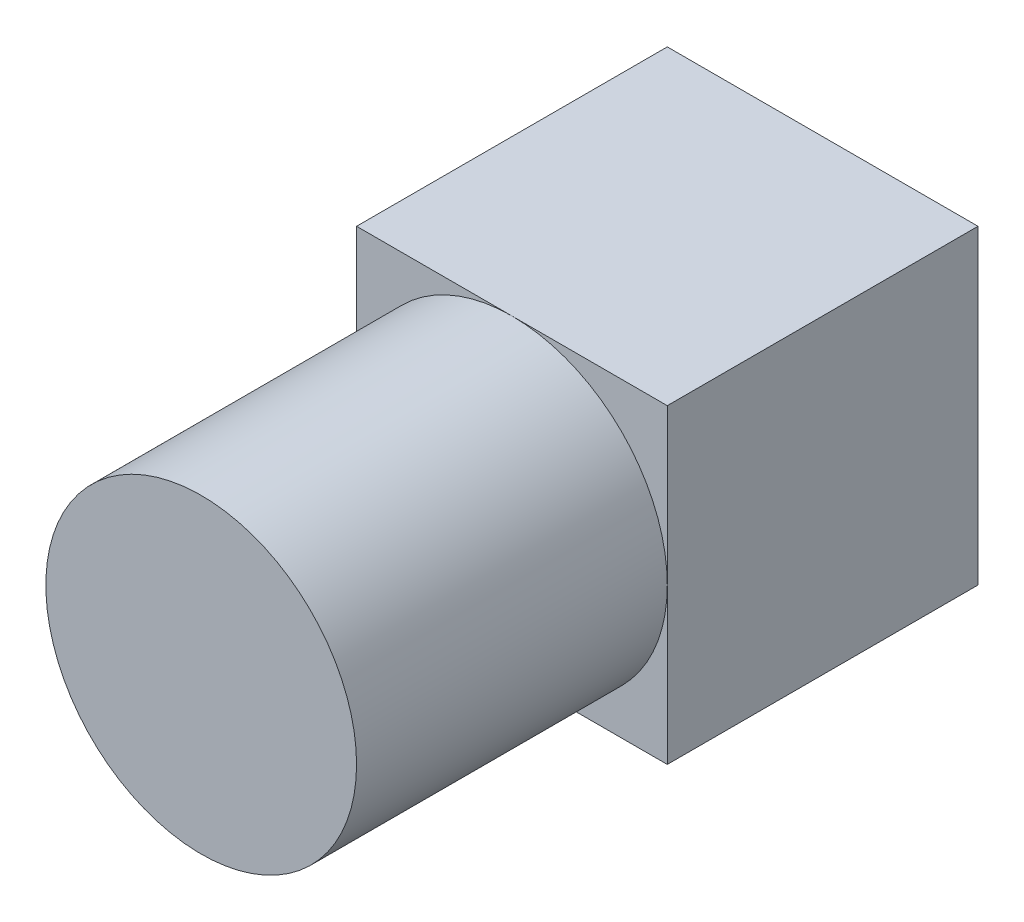
ISO-10303-21;
HEADER;
FILE_DESCRIPTION(('STEP AP214'),'2;1');
FILE_NAME('part.step','',(''),(''),'','','');
FILE_SCHEMA(('AUTOMOTIVE_DESIGN { 1 0 10303 214 1 1 1 1 }'));
ENDSEC;
DATA;
#1=APPLICATION_CONTEXT('core data for automotive mechanical design processes');
#2=APPLICATION_PROTOCOL_DEFINITION('international standard','automotive_design',2000,#1);
#3=PRODUCT_CONTEXT('',#1,'mechanical');
#4=PRODUCT('Part','Part','',(#3));
#5=PRODUCT_RELATED_PRODUCT_CATEGORY('part','',(#4));
#6=PRODUCT_DEFINITION_FORMATION('','',#4);
#7=PRODUCT_DEFINITION_CONTEXT('part definition',#1,'design');
#8=PRODUCT_DEFINITION('design','',#6,#7);
#9=PRODUCT_DEFINITION_SHAPE('','',#8);
#10=(LENGTH_UNIT() NAMED_UNIT(*) SI_UNIT(.MILLI.,.METRE.));
#11=(NAMED_UNIT(*) PLANE_ANGLE_UNIT() SI_UNIT($,.RADIAN.));
#12=(NAMED_UNIT(*) SI_UNIT($,.STERADIAN.) SOLID_ANGLE_UNIT());
#13=UNCERTAINTY_MEASURE_WITH_UNIT(LENGTH_MEASURE(1.E-05),#10,'distance_accuracy_value','');
#14=(GEOMETRIC_REPRESENTATION_CONTEXT(3) GLOBAL_UNCERTAINTY_ASSIGNED_CONTEXT((#13)) GLOBAL_UNIT_ASSIGNED_CONTEXT((#10,
#11,#12)) REPRESENTATION_CONTEXT('',''));
#15=CARTESIAN_POINT('',(0.,0.,0.));
#16=DIRECTION('',(0.,0.,1.));
#17=DIRECTION('',(1.,0.,0.));
#18=AXIS2_PLACEMENT_3D('',#15,#16,#17);
#19=CARTESIAN_POINT('',(0.,0.,0.));
#20=DIRECTION('',(0.,0.,1.));
#21=DIRECTION('',(1.,0.,0.));
#22=AXIS2_PLACEMENT_3D('',#19,#20,#21);
#23=PLANE('',#22);
#24=CARTESIAN_POINT('',(0.,0.,0.));
#25=DIRECTION('',(0.,0.,1.));
#26=DIRECTION('',(1.,0.,0.));
#27=AXIS2_PLACEMENT_3D('',#24,#25,#26);
#28=CIRCLE('',#27,1.27);
#29=CARTESIAN_POINT('',(1.27,0.,0.));
#30=VERTEX_POINT('',#29);
#31=CARTESIAN_POINT('',(0.,1.27,0.));
#32=VERTEX_POINT('',#31);
#33=EDGE_CURVE('E45',#30,#32,#28,.T.);
#34=ORIENTED_EDGE('',*,*,#33,.F.);
#35=DIRECTION('',(0.,1.,0.));
#36=VECTOR('',#35,1.);
#37=CARTESIAN_POINT('',(1.27,1.27,0.));
#38=LINE('',#37,#36);
#39=CARTESIAN_POINT('',(1.27,1.27,0.));
#40=VERTEX_POINT('',#39);
#41=EDGE_CURVE('E95',#30,#40,#38,.T.);
#42=ORIENTED_EDGE('',*,*,#41,.T.);
#43=DIRECTION('',(-1.,0.,0.));
#44=VECTOR('',#43,1.);
#45=CARTESIAN_POINT('',(-1.27,1.27,0.));
#46=LINE('',#45,#44);
#47=EDGE_CURVE('E105',#40,#32,#46,.T.);
#48=ORIENTED_EDGE('',*,*,#47,.T.);
#49=EDGE_LOOP('',(#34,#42,#48));
#50=FACE_BOUND('',#49,.T.);
#51=ADVANCED_FACE('F34',(#50),#23,.T.);
#52=CARTESIAN_POINT('',(-1.27,0.,0.));
#53=VERTEX_POINT('',#52);
#54=EDGE_CURVE('E11',#32,#53,#28,.T.);
#55=ORIENTED_EDGE('',*,*,#54,.F.);
#56=CARTESIAN_POINT('',(-1.27,1.27,0.));
#57=VERTEX_POINT('',#56);
#58=EDGE_CURVE('E94',#32,#57,#46,.T.);
#59=ORIENTED_EDGE('',*,*,#58,.T.);
#60=DIRECTION('',(0.,-1.,0.));
#61=VECTOR('',#60,1.);
#62=CARTESIAN_POINT('',(-1.27,1.27,0.));
#63=LINE('',#62,#61);
#64=EDGE_CURVE('E127',#57,#53,#63,.T.);
#65=ORIENTED_EDGE('',*,*,#64,.T.);
#66=EDGE_LOOP('',(#55,#59,#65));
#67=FACE_BOUND('',#66,.T.);
#68=ADVANCED_FACE('F143',(#67),#23,.T.);
#69=CARTESIAN_POINT('',(0.,-1.27,0.));
#70=VERTEX_POINT('',#69);
#71=EDGE_CURVE('E43',#53,#70,#28,.T.);
#72=ORIENTED_EDGE('',*,*,#71,.F.);
#73=CARTESIAN_POINT('',(-1.27,-1.27,0.));
#74=VERTEX_POINT('',#73);
#75=EDGE_CURVE('E126',#53,#74,#63,.T.);
#76=ORIENTED_EDGE('',*,*,#75,.T.);
#77=DIRECTION('',(1.,0.,0.));
#78=VECTOR('',#77,1.);
#79=CARTESIAN_POINT('',(-1.27,-1.27,0.));
#80=LINE('',#79,#78);
#81=EDGE_CURVE('E116',#74,#70,#80,.T.);
#82=ORIENTED_EDGE('',*,*,#81,.T.);
#83=EDGE_LOOP('',(#72,#76,#82));
#84=FACE_BOUND('',#83,.T.);
#85=ADVANCED_FACE('F145',(#84),#23,.T.);
#86=CARTESIAN_POINT('',(1.27,1.27,-2.54));
#87=DIRECTION('',(1.,0.,0.));
#88=DIRECTION('',(0.,0.,-1.));
#89=AXIS2_PLACEMENT_3D('',#86,#87,#88);
#90=PLANE('',#89);
#91=CARTESIAN_POINT('',(1.27,-1.27,0.));
#92=VERTEX_POINT('',#91);
#93=EDGE_CURVE('E88',#92,#30,#38,.T.);
#94=ORIENTED_EDGE('',*,*,#93,.F.);
#95=DIRECTION('',(0.,0.,1.));
#96=VECTOR('',#95,1.);
#97=CARTESIAN_POINT('',(1.27,-1.27,-2.54));
#98=LINE('',#97,#96);
#99=CARTESIAN_POINT('',(1.27,-1.27,-2.54));
#100=VERTEX_POINT('',#99);
#101=EDGE_CURVE('E108',#100,#92,#98,.T.);
#102=ORIENTED_EDGE('',*,*,#101,.F.);
#103=DIRECTION('',(0.,1.,0.));
#104=VECTOR('',#103,1.);
#105=CARTESIAN_POINT('',(1.27,1.27,-2.54));
#106=LINE('',#105,#104);
#107=CARTESIAN_POINT('',(1.27,1.27,-2.54));
#108=VERTEX_POINT('',#107);
#109=EDGE_CURVE('E113',#100,#108,#106,.T.);
#110=ORIENTED_EDGE('',*,*,#109,.T.);
#111=DIRECTION('',(0.,0.,1.));
#112=VECTOR('',#111,1.);
#113=CARTESIAN_POINT('',(1.27,1.27,-2.54));
#114=LINE('',#113,#112);
#115=EDGE_CURVE('E38',#108,#40,#114,.T.);
#116=ORIENTED_EDGE('',*,*,#115,.T.);
#117=ORIENTED_EDGE('',*,*,#41,.F.);
#118=EDGE_LOOP('',(#94,#102,#110,#116,#117));
#119=FACE_BOUND('',#118,.T.);
#120=ADVANCED_FACE('F36',(#119),#90,.T.);
#121=CARTESIAN_POINT('',(-1.27,-1.27,-2.54));
#122=DIRECTION('',(0.,-1.,0.));
#123=DIRECTION('',(1.,0.,0.));
#124=AXIS2_PLACEMENT_3D('',#121,#122,#123);
#125=PLANE('',#124);
#126=ORIENTED_EDGE('',*,*,#81,.F.);
#127=DIRECTION('',(0.,0.,1.));
#128=VECTOR('',#127,1.);
#129=CARTESIAN_POINT('',(-1.27,-1.27,-2.54));
#130=LINE('',#129,#128);
#131=CARTESIAN_POINT('',(-1.27,-1.27,-2.54));
#132=VERTEX_POINT('',#131);
#133=EDGE_CURVE('E109',#132,#74,#130,.T.);
#134=ORIENTED_EDGE('',*,*,#133,.F.);
#135=DIRECTION('',(1.,0.,0.));
#136=VECTOR('',#135,1.);
#137=CARTESIAN_POINT('',(-1.27,-1.27,-2.54));
#138=LINE('',#137,#136);
#139=EDGE_CURVE('E122',#132,#100,#138,.T.);
#140=ORIENTED_EDGE('',*,*,#139,.T.);
#141=ORIENTED_EDGE('',*,*,#101,.T.);
#142=EDGE_CURVE('E91',#70,#92,#80,.T.);
#143=ORIENTED_EDGE('',*,*,#142,.F.);
#144=EDGE_LOOP('',(#126,#134,#140,#141,#143));
#145=FACE_BOUND('',#144,.T.);
#146=ADVANCED_FACE('F156',(#145),#125,.T.);
#147=CARTESIAN_POINT('',(-1.27,1.27,-2.54));
#148=DIRECTION('',(-1.,0.,0.));
#149=DIRECTION('',(0.,0.,1.));
#150=AXIS2_PLACEMENT_3D('',#147,#148,#149);
#151=PLANE('',#150);
#152=ORIENTED_EDGE('',*,*,#64,.F.);
#153=DIRECTION('',(0.,0.,1.));
#154=VECTOR('',#153,1.);
#155=CARTESIAN_POINT('',(-1.27,1.27,-2.54));
#156=LINE('',#155,#154);
#157=CARTESIAN_POINT('',(-1.27,1.27,-2.54));
#158=VERTEX_POINT('',#157);
#159=EDGE_CURVE('E132',#158,#57,#156,.T.);
#160=ORIENTED_EDGE('',*,*,#159,.F.);
#161=DIRECTION('',(0.,-1.,0.));
#162=VECTOR('',#161,1.);
#163=CARTESIAN_POINT('',(-1.27,1.27,-2.54));
#164=LINE('',#163,#162);
#165=EDGE_CURVE('E119',#158,#132,#164,.T.);
#166=ORIENTED_EDGE('',*,*,#165,.T.);
#167=ORIENTED_EDGE('',*,*,#133,.T.);
#168=ORIENTED_EDGE('',*,*,#75,.F.);
#169=EDGE_LOOP('',(#152,#160,#166,#167,#168));
#170=FACE_BOUND('',#169,.T.);
#171=ADVANCED_FACE('F141',(#170),#151,.T.);
#172=CARTESIAN_POINT('',(-1.27,1.27,-2.54));
#173=DIRECTION('',(0.,1.,0.));
#174=DIRECTION('',(0.,0.,1.));
#175=AXIS2_PLACEMENT_3D('',#172,#173,#174);
#176=PLANE('',#175);
#177=ORIENTED_EDGE('',*,*,#47,.F.);
#178=ORIENTED_EDGE('',*,*,#115,.F.);
#179=DIRECTION('',(-1.,0.,0.));
#180=VECTOR('',#179,1.);
#181=CARTESIAN_POINT('',(-1.27,1.27,-2.54));
#182=LINE('',#181,#180);
#183=EDGE_CURVE('E115',#108,#158,#182,.T.);
#184=ORIENTED_EDGE('',*,*,#183,.T.);
#185=ORIENTED_EDGE('',*,*,#159,.T.);
#186=ORIENTED_EDGE('',*,*,#58,.F.);
#187=EDGE_LOOP('',(#177,#178,#184,#185,#186));
#188=FACE_BOUND('',#187,.T.);
#189=ADVANCED_FACE('F137',(#188),#176,.T.);
#190=CARTESIAN_POINT('',(0.,0.,-2.54));
#191=DIRECTION('',(0.,0.,1.));
#192=DIRECTION('',(1.,0.,0.));
#193=AXIS2_PLACEMENT_3D('',#190,#191,#192);
#194=PLANE('',#193);
#195=ORIENTED_EDGE('',*,*,#109,.F.);
#196=ORIENTED_EDGE('',*,*,#139,.F.);
#197=ORIENTED_EDGE('',*,*,#165,.F.);
#198=ORIENTED_EDGE('',*,*,#183,.F.);
#199=EDGE_LOOP('',(#195,#196,#197,#198));
#200=FACE_BOUND('',#199,.T.);
#201=ADVANCED_FACE('F154',(#200),#194,.F.);
#202=EDGE_CURVE('E52',#70,#30,#28,.T.);
#203=ORIENTED_EDGE('',*,*,#202,.F.);
#204=ORIENTED_EDGE('',*,*,#142,.T.);
#205=ORIENTED_EDGE('',*,*,#93,.T.);
#206=EDGE_LOOP('',(#203,#204,#205));
#207=FACE_BOUND('',#206,.T.);
#208=ADVANCED_FACE('F90',(#207),#23,.T.);
#209=CARTESIAN_POINT('',(0.,0.,2.54));
#210=DIRECTION('',(0.,0.,-1.));
#211=DIRECTION('',(-1.,0.,0.));
#212=AXIS2_PLACEMENT_3D('',#209,#210,#211);
#213=CYLINDRICAL_SURFACE('',#212,1.27);
#214=CARTESIAN_POINT('',(0.,0.,2.54));
#215=DIRECTION('',(0.,0.,1.));
#216=DIRECTION('',(1.,0.,0.));
#217=AXIS2_PLACEMENT_3D('',#214,#215,#216);
#218=CIRCLE('',#217,1.27);
#219=CARTESIAN_POINT('',(1.27,0.,2.54));
#220=VERTEX_POINT('',#219);
#221=EDGE_CURVE('E103',#220,#220,#218,.T.);
#222=ORIENTED_EDGE('',*,*,#221,.F.);
#223=EDGE_LOOP('',(#222));
#224=FACE_BOUND('',#223,.T.);
#225=ORIENTED_EDGE('',*,*,#33,.T.);
#226=ORIENTED_EDGE('',*,*,#54,.T.);
#227=ORIENTED_EDGE('',*,*,#71,.T.);
#228=ORIENTED_EDGE('',*,*,#202,.T.);
#229=EDGE_LOOP('',(#225,#226,#227,#228));
#230=FACE_BOUND('',#229,.T.);
#231=ADVANCED_FACE('F107',(#224,#230),#213,.T.);
#232=CARTESIAN_POINT('',(0.,0.,2.54));
#233=DIRECTION('',(0.,0.,1.));
#234=DIRECTION('',(1.,0.,0.));
#235=AXIS2_PLACEMENT_3D('',#232,#233,#234);
#236=PLANE('',#235);
#237=ORIENTED_EDGE('',*,*,#221,.T.);
#238=EDGE_LOOP('',(#237));
#239=FACE_BOUND('',#238,.T.);
#240=ADVANCED_FACE('F182',(#239),#236,.T.);
#241=CLOSED_SHELL('',(#51,#68,#85,#120,#146,#171,#189,#201,#208,#231,#240));
#242=MANIFOLD_SOLID_BREP('B2',#241);
#243=ADVANCED_BREP_SHAPE_REPRESENTATION('',(#18,#242),#14);
#244=SHAPE_DEFINITION_REPRESENTATION(#9,#243);
ENDSEC;
END-ISO-10303-21;
